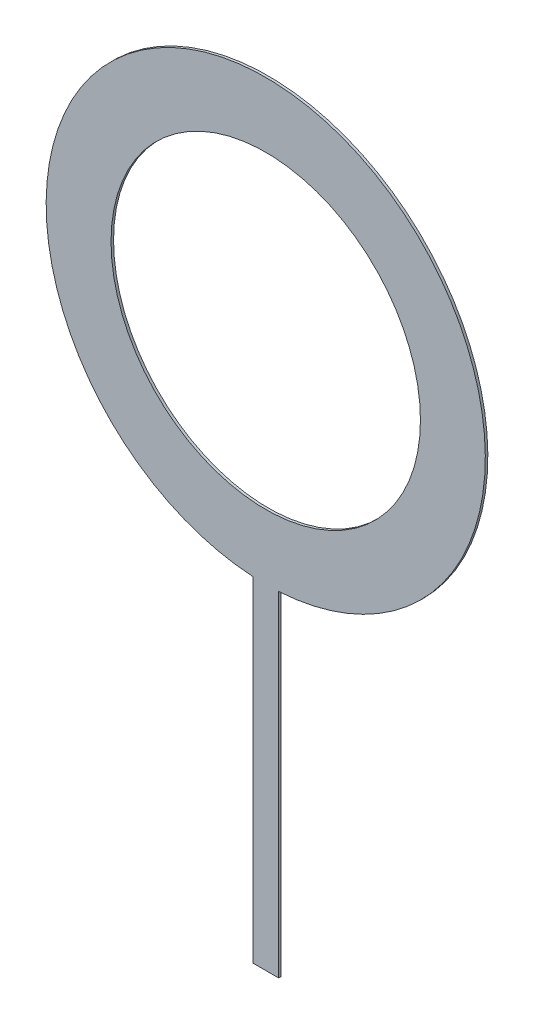
ISO-10303-21;
HEADER;
FILE_DESCRIPTION(('STEP AP214'),'2;1');
FILE_NAME('part.step','',(''),(''),'','','');
FILE_SCHEMA(('AUTOMOTIVE_DESIGN { 1 0 10303 214 1 1 1 1 }'));
ENDSEC;
DATA;
#1=APPLICATION_CONTEXT('core data for automotive mechanical design processes');
#2=APPLICATION_PROTOCOL_DEFINITION('international standard','automotive_design',2000,#1);
#3=PRODUCT_CONTEXT('',#1,'mechanical');
#4=PRODUCT('Part','Part','',(#3));
#5=PRODUCT_RELATED_PRODUCT_CATEGORY('part','',(#4));
#6=PRODUCT_DEFINITION_FORMATION('','',#4);
#7=PRODUCT_DEFINITION_CONTEXT('part definition',#1,'design');
#8=PRODUCT_DEFINITION('design','',#6,#7);
#9=PRODUCT_DEFINITION_SHAPE('','',#8);
#10=(LENGTH_UNIT() NAMED_UNIT(*) SI_UNIT(.MILLI.,.METRE.));
#11=(NAMED_UNIT(*) PLANE_ANGLE_UNIT() SI_UNIT($,.RADIAN.));
#12=(NAMED_UNIT(*) SI_UNIT($,.STERADIAN.) SOLID_ANGLE_UNIT());
#13=UNCERTAINTY_MEASURE_WITH_UNIT(LENGTH_MEASURE(1.E-05),#10,'distance_accuracy_value','');
#14=(GEOMETRIC_REPRESENTATION_CONTEXT(3) GLOBAL_UNCERTAINTY_ASSIGNED_CONTEXT((#13)) GLOBAL_UNIT_ASSIGNED_CONTEXT((#10,
#11,#12)) REPRESENTATION_CONTEXT('',''));
#15=CARTESIAN_POINT('',(0.,0.,0.));
#16=DIRECTION('',(0.,0.,1.));
#17=DIRECTION('',(1.,0.,0.));
#18=AXIS2_PLACEMENT_3D('',#15,#16,#17);
#19=CARTESIAN_POINT('',(0.,-27.75,0.127));
#20=DIRECTION('',(0.,1.,0.));
#21=DIRECTION('',(0.,0.,1.));
#22=AXIS2_PLACEMENT_3D('',#19,#20,#21);
#23=PLANE('',#22);
#24=DIRECTION('',(1.,0.,0.));
#25=VECTOR('',#24,1.);
#26=CARTESIAN_POINT('',(0.,-27.75,0.));
#27=LINE('',#26,#25);
#28=CARTESIAN_POINT('',(-0.65,-27.75,0.));
#29=VERTEX_POINT('',#28);
#30=CARTESIAN_POINT('',(0.65,-27.75,0.));
#31=VERTEX_POINT('',#30);
#32=EDGE_CURVE('E102',#29,#31,#27,.T.);
#33=ORIENTED_EDGE('',*,*,#32,.T.);
#34=DIRECTION('',(0.,0.,-1.));
#35=VECTOR('',#34,1.);
#36=CARTESIAN_POINT('',(0.65,-27.75,0.127));
#37=LINE('',#36,#35);
#38=CARTESIAN_POINT('',(0.65,-27.75,0.127));
#39=VERTEX_POINT('',#38);
#40=EDGE_CURVE('E11',#39,#31,#37,.T.);
#41=ORIENTED_EDGE('',*,*,#40,.F.);
#42=DIRECTION('',(1.,0.,0.));
#43=VECTOR('',#42,1.);
#44=CARTESIAN_POINT('',(0.,-27.75,0.127));
#45=LINE('',#44,#43);
#46=CARTESIAN_POINT('',(-0.65,-27.75,0.127));
#47=VERTEX_POINT('',#46);
#48=EDGE_CURVE('E85',#47,#39,#45,.T.);
#49=ORIENTED_EDGE('',*,*,#48,.F.);
#50=DIRECTION('',(0.,0.,-1.));
#51=VECTOR('',#50,1.);
#52=CARTESIAN_POINT('',(-0.65,-27.75,0.127));
#53=LINE('',#52,#51);
#54=EDGE_CURVE('E51',#47,#29,#53,.T.);
#55=ORIENTED_EDGE('',*,*,#54,.T.);
#56=EDGE_LOOP('',(#33,#41,#49,#55));
#57=FACE_BOUND('',#56,.T.);
#58=ADVANCED_FACE('F35',(#57),#23,.F.);
#59=CARTESIAN_POINT('',(0.650000000000001,0.,0.127));
#60=DIRECTION('',(-1.,0.,0.));
#61=DIRECTION('',(0.,-1.,0.));
#62=AXIS2_PLACEMENT_3D('',#59,#60,#61);
#63=PLANE('',#62);
#64=DIRECTION('',(0.,1.,0.));
#65=VECTOR('',#64,1.);
#66=CARTESIAN_POINT('',(0.650000000000001,0.,0.));
#67=LINE('',#66,#65);
#68=CARTESIAN_POINT('',(0.650000000000001,-10.9807786609147,0.));
#69=VERTEX_POINT('',#68);
#70=EDGE_CURVE('E90',#31,#69,#67,.T.);
#71=ORIENTED_EDGE('',*,*,#70,.T.);
#72=DIRECTION('',(0.,0.,-1.));
#73=VECTOR('',#72,1.);
#74=CARTESIAN_POINT('',(0.650000000000001,-10.9807786609147,0.127));
#75=LINE('',#74,#73);
#76=CARTESIAN_POINT('',(0.650000000000001,-10.9807786609147,0.127));
#77=VERTEX_POINT('',#76);
#78=EDGE_CURVE('E43',#77,#69,#75,.T.);
#79=ORIENTED_EDGE('',*,*,#78,.F.);
#80=DIRECTION('',(0.,1.,0.));
#81=VECTOR('',#80,1.);
#82=CARTESIAN_POINT('',(0.650000000000001,0.,0.127));
#83=LINE('',#82,#81);
#84=EDGE_CURVE('E77',#39,#77,#83,.T.);
#85=ORIENTED_EDGE('',*,*,#84,.F.);
#86=ORIENTED_EDGE('',*,*,#40,.T.);
#87=EDGE_LOOP('',(#71,#79,#85,#86));
#88=FACE_BOUND('',#87,.T.);
#89=ADVANCED_FACE('F89',(#88),#63,.F.);
#90=CARTESIAN_POINT('',(0.,0.,0.127));
#91=DIRECTION('',(0.,0.,-1.));
#92=DIRECTION('',(-1.,0.,0.));
#93=AXIS2_PLACEMENT_3D('',#90,#91,#92);
#94=CYLINDRICAL_SURFACE('',#93,11.);
#95=CARTESIAN_POINT('',(0.,0.,0.));
#96=DIRECTION('',(0.,0.,1.));
#97=DIRECTION('',(1.,0.,0.));
#98=AXIS2_PLACEMENT_3D('',#95,#96,#97);
#99=CIRCLE('',#98,11.);
#100=CARTESIAN_POINT('',(-0.65,-10.9807786609147,0.));
#101=VERTEX_POINT('',#100);
#102=EDGE_CURVE('E105',#69,#101,#99,.T.);
#103=ORIENTED_EDGE('',*,*,#102,.T.);
#104=DIRECTION('',(0.,0.,-1.));
#105=VECTOR('',#104,1.);
#106=CARTESIAN_POINT('',(-0.65,-10.9807786609147,0.127));
#107=LINE('',#106,#105);
#108=CARTESIAN_POINT('',(-0.65,-10.9807786609147,0.127));
#109=VERTEX_POINT('',#108);
#110=EDGE_CURVE('E66',#109,#101,#107,.T.);
#111=ORIENTED_EDGE('',*,*,#110,.F.);
#112=CARTESIAN_POINT('',(0.,0.,0.127));
#113=DIRECTION('',(0.,0.,1.));
#114=DIRECTION('',(1.,0.,0.));
#115=AXIS2_PLACEMENT_3D('',#112,#113,#114);
#116=CIRCLE('',#115,11.);
#117=EDGE_CURVE('E84',#77,#109,#116,.T.);
#118=ORIENTED_EDGE('',*,*,#117,.F.);
#119=ORIENTED_EDGE('',*,*,#78,.T.);
#120=EDGE_LOOP('',(#103,#111,#118,#119));
#121=FACE_BOUND('',#120,.T.);
#122=ADVANCED_FACE('F93',(#121),#94,.T.);
#123=CARTESIAN_POINT('',(-0.65,0.,0.127));
#124=DIRECTION('',(-1.,0.,0.));
#125=DIRECTION('',(0.,-1.,0.));
#126=AXIS2_PLACEMENT_3D('',#123,#124,#125);
#127=PLANE('',#126);
#128=DIRECTION('',(0.,1.,0.));
#129=VECTOR('',#128,1.);
#130=CARTESIAN_POINT('',(-0.65,0.,0.));
#131=LINE('',#130,#129);
#132=EDGE_CURVE('E107',#29,#101,#131,.T.);
#133=ORIENTED_EDGE('',*,*,#132,.F.);
#134=ORIENTED_EDGE('',*,*,#54,.F.);
#135=DIRECTION('',(0.,1.,0.));
#136=VECTOR('',#135,1.);
#137=CARTESIAN_POINT('',(-0.65,0.,0.127));
#138=LINE('',#137,#136);
#139=EDGE_CURVE('E94',#47,#109,#138,.T.);
#140=ORIENTED_EDGE('',*,*,#139,.T.);
#141=ORIENTED_EDGE('',*,*,#110,.T.);
#142=EDGE_LOOP('',(#133,#134,#140,#141));
#143=FACE_BOUND('',#142,.T.);
#144=ADVANCED_FACE('F120',(#143),#127,.T.);
#145=CARTESIAN_POINT('',(0.,0.,0.127));
#146=DIRECTION('',(0.,0.,-1.));
#147=DIRECTION('',(-1.,0.,0.));
#148=AXIS2_PLACEMENT_3D('',#145,#146,#147);
#149=CYLINDRICAL_SURFACE('',#148,7.75);
#150=CARTESIAN_POINT('',(0.,0.,0.127));
#151=DIRECTION('',(0.,0.,1.));
#152=DIRECTION('',(1.,0.,0.));
#153=AXIS2_PLACEMENT_3D('',#150,#151,#152);
#154=CIRCLE('',#153,7.75);
#155=CARTESIAN_POINT('',(7.75,0.,0.127));
#156=VERTEX_POINT('',#155);
#157=EDGE_CURVE('E96',#156,#156,#154,.T.);
#158=ORIENTED_EDGE('',*,*,#157,.T.);
#159=EDGE_LOOP('',(#158));
#160=FACE_BOUND('',#159,.T.);
#161=CARTESIAN_POINT('',(0.,0.,0.));
#162=DIRECTION('',(0.,0.,1.));
#163=DIRECTION('',(1.,0.,0.));
#164=AXIS2_PLACEMENT_3D('',#161,#162,#163);
#165=CIRCLE('',#164,7.75);
#166=CARTESIAN_POINT('',(7.75,0.,0.));
#167=VERTEX_POINT('',#166);
#168=EDGE_CURVE('E110',#167,#167,#165,.T.);
#169=ORIENTED_EDGE('',*,*,#168,.F.);
#170=EDGE_LOOP('',(#169));
#171=FACE_BOUND('',#170,.T.);
#172=ADVANCED_FACE('F118',(#160,#171),#149,.F.);
#173=CARTESIAN_POINT('',(0.,0.,0.127));
#174=DIRECTION('',(0.,0.,1.));
#175=DIRECTION('',(1.,0.,0.));
#176=AXIS2_PLACEMENT_3D('',#173,#174,#175);
#177=PLANE('',#176);
#178=ORIENTED_EDGE('',*,*,#48,.T.);
#179=ORIENTED_EDGE('',*,*,#84,.T.);
#180=ORIENTED_EDGE('',*,*,#117,.T.);
#181=ORIENTED_EDGE('',*,*,#139,.F.);
#182=EDGE_LOOP('',(#178,#179,#180,#181));
#183=FACE_BOUND('',#182,.T.);
#184=ORIENTED_EDGE('',*,*,#157,.F.);
#185=EDGE_LOOP('',(#184));
#186=FACE_BOUND('',#185,.T.);
#187=ADVANCED_FACE('F80',(#183,#186),#177,.T.);
#188=CARTESIAN_POINT('',(0.,0.,0.));
#189=DIRECTION('',(0.,0.,1.));
#190=DIRECTION('',(1.,0.,0.));
#191=AXIS2_PLACEMENT_3D('',#188,#189,#190);
#192=PLANE('',#191);
#193=ORIENTED_EDGE('',*,*,#32,.F.);
#194=ORIENTED_EDGE('',*,*,#132,.T.);
#195=ORIENTED_EDGE('',*,*,#102,.F.);
#196=ORIENTED_EDGE('',*,*,#70,.F.);
#197=EDGE_LOOP('',(#193,#194,#195,#196));
#198=FACE_BOUND('',#197,.T.);
#199=ORIENTED_EDGE('',*,*,#168,.T.);
#200=EDGE_LOOP('',(#199));
#201=FACE_BOUND('',#200,.T.);
#202=ADVANCED_FACE('F116',(#198,#201),#192,.F.);
#203=CLOSED_SHELL('',(#58,#89,#122,#144,#172,#187,#202));
#204=MANIFOLD_SOLID_BREP('B2',#203);
#205=ADVANCED_BREP_SHAPE_REPRESENTATION('',(#18,#204),#14);
#206=SHAPE_DEFINITION_REPRESENTATION(#9,#205);
ENDSEC;
END-ISO-10303-21;
